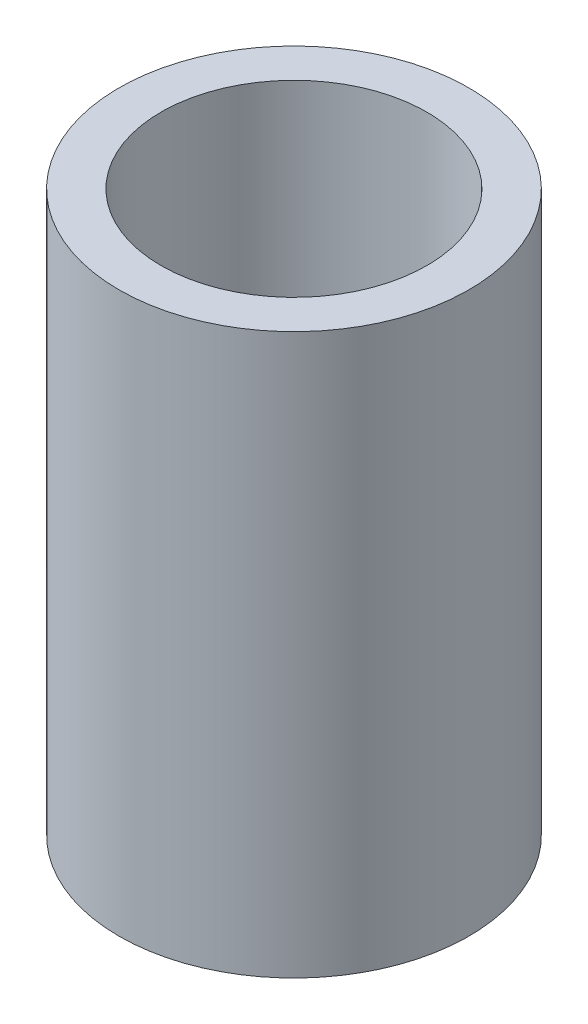
ISO-10303-21;
HEADER;
FILE_DESCRIPTION(('STEP AP214'),'2;1');
FILE_NAME('part.step','',(''),(''),'','','');
FILE_SCHEMA(('AUTOMOTIVE_DESIGN { 1 0 10303 214 1 1 1 1 }'));
ENDSEC;
DATA;
#1=APPLICATION_CONTEXT('core data for automotive mechanical design processes');
#2=APPLICATION_PROTOCOL_DEFINITION('international standard','automotive_design',2000,#1);
#3=PRODUCT_CONTEXT('',#1,'mechanical');
#4=PRODUCT('Part','Part','',(#3));
#5=PRODUCT_RELATED_PRODUCT_CATEGORY('part','',(#4));
#6=PRODUCT_DEFINITION_FORMATION('','',#4);
#7=PRODUCT_DEFINITION_CONTEXT('part definition',#1,'design');
#8=PRODUCT_DEFINITION('design','',#6,#7);
#9=PRODUCT_DEFINITION_SHAPE('','',#8);
#10=(LENGTH_UNIT() NAMED_UNIT(*) SI_UNIT(.MILLI.,.METRE.));
#11=(NAMED_UNIT(*) PLANE_ANGLE_UNIT() SI_UNIT($,.RADIAN.));
#12=(NAMED_UNIT(*) SI_UNIT($,.STERADIAN.) SOLID_ANGLE_UNIT());
#13=UNCERTAINTY_MEASURE_WITH_UNIT(LENGTH_MEASURE(1.E-05),#10,'distance_accuracy_value','');
#14=(GEOMETRIC_REPRESENTATION_CONTEXT(3) GLOBAL_UNCERTAINTY_ASSIGNED_CONTEXT((#13)) GLOBAL_UNIT_ASSIGNED_CONTEXT((#10,
#11,#12)) REPRESENTATION_CONTEXT('',''));
#15=CARTESIAN_POINT('',(0.,0.,0.));
#16=DIRECTION('',(0.,0.,1.));
#17=DIRECTION('',(1.,0.,0.));
#18=AXIS2_PLACEMENT_3D('',#15,#16,#17);
#19=CARTESIAN_POINT('',(0.,40.,0.));
#20=DIRECTION('',(0.,1.,0.));
#21=DIRECTION('',(0.,0.,1.));
#22=AXIS2_PLACEMENT_3D('',#19,#20,#21);
#23=PLANE('',#22);
#24=CARTESIAN_POINT('',(0.,40.,0.));
#25=DIRECTION('',(0.,1.,0.));
#26=DIRECTION('',(0.,0.,1.));
#27=AXIS2_PLACEMENT_3D('',#24,#25,#26);
#28=CIRCLE('',#27,12.5);
#29=CARTESIAN_POINT('',(0.,40.,12.5));
#30=VERTEX_POINT('',#29);
#31=EDGE_CURVE('E10',#30,#30,#28,.T.);
#32=ORIENTED_EDGE('',*,*,#31,.T.);
#33=EDGE_LOOP('',(#32));
#34=FACE_BOUND('',#33,.T.);
#35=CARTESIAN_POINT('',(0.,40.,0.));
#36=DIRECTION('',(0.,1.,0.));
#37=DIRECTION('',(0.,0.,1.));
#38=AXIS2_PLACEMENT_3D('',#35,#36,#37);
#39=CIRCLE('',#38,9.5);
#40=CARTESIAN_POINT('',(0.,40.,9.5));
#41=VERTEX_POINT('',#40);
#42=EDGE_CURVE('E42',#41,#41,#39,.T.);
#43=ORIENTED_EDGE('',*,*,#42,.F.);
#44=EDGE_LOOP('',(#43));
#45=FACE_BOUND('',#44,.T.);
#46=ADVANCED_FACE('F31',(#34,#45),#23,.T.);
#47=CARTESIAN_POINT('',(0.,0.,0.));
#48=DIRECTION('',(0.,1.,0.));
#49=DIRECTION('',(0.,0.,1.));
#50=AXIS2_PLACEMENT_3D('',#47,#48,#49);
#51=PLANE('',#50);
#52=CARTESIAN_POINT('',(0.,0.,0.));
#53=DIRECTION('',(0.,1.,0.));
#54=DIRECTION('',(0.,0.,1.));
#55=AXIS2_PLACEMENT_3D('',#52,#53,#54);
#56=CIRCLE('',#55,12.5);
#57=CARTESIAN_POINT('',(0.,0.,12.5));
#58=VERTEX_POINT('',#57);
#59=EDGE_CURVE('E35',#58,#58,#56,.T.);
#60=ORIENTED_EDGE('',*,*,#59,.F.);
#61=EDGE_LOOP('',(#60));
#62=FACE_BOUND('',#61,.T.);
#63=CARTESIAN_POINT('',(0.,0.,0.));
#64=DIRECTION('',(0.,1.,0.));
#65=DIRECTION('',(0.,0.,1.));
#66=AXIS2_PLACEMENT_3D('',#63,#64,#65);
#67=CIRCLE('',#66,9.5);
#68=CARTESIAN_POINT('',(0.,0.,9.5));
#69=VERTEX_POINT('',#68);
#70=EDGE_CURVE('E44',#69,#69,#67,.T.);
#71=ORIENTED_EDGE('',*,*,#70,.T.);
#72=EDGE_LOOP('',(#71));
#73=FACE_BOUND('',#72,.T.);
#74=ADVANCED_FACE('F54',(#62,#73),#51,.F.);
#75=CARTESIAN_POINT('',(0.,40.,0.));
#76=DIRECTION('',(0.,-1.,0.));
#77=DIRECTION('',(0.,0.,-1.));
#78=AXIS2_PLACEMENT_3D('',#75,#76,#77);
#79=CYLINDRICAL_SURFACE('',#78,12.5);
#80=ORIENTED_EDGE('',*,*,#31,.F.);
#81=EDGE_LOOP('',(#80));
#82=FACE_BOUND('',#81,.T.);
#83=ORIENTED_EDGE('',*,*,#59,.T.);
#84=EDGE_LOOP('',(#83));
#85=FACE_BOUND('',#84,.T.);
#86=ADVANCED_FACE('F33',(#82,#85),#79,.T.);
#87=CARTESIAN_POINT('',(0.,40.,0.));
#88=DIRECTION('',(0.,-1.,0.));
#89=DIRECTION('',(0.,0.,-1.));
#90=AXIS2_PLACEMENT_3D('',#87,#88,#89);
#91=CYLINDRICAL_SURFACE('',#90,9.5);
#92=ORIENTED_EDGE('',*,*,#42,.T.);
#93=EDGE_LOOP('',(#92));
#94=FACE_BOUND('',#93,.T.);
#95=ORIENTED_EDGE('',*,*,#70,.F.);
#96=EDGE_LOOP('',(#95));
#97=FACE_BOUND('',#96,.T.);
#98=ADVANCED_FACE('F50',(#94,#97),#91,.F.);
#99=CLOSED_SHELL('',(#46,#74,#86,#98));
#100=MANIFOLD_SOLID_BREP('B2',#99);
#101=ADVANCED_BREP_SHAPE_REPRESENTATION('',(#18,#100),#14);
#102=SHAPE_DEFINITION_REPRESENTATION(#9,#101);
ENDSEC;
END-ISO-10303-21;
